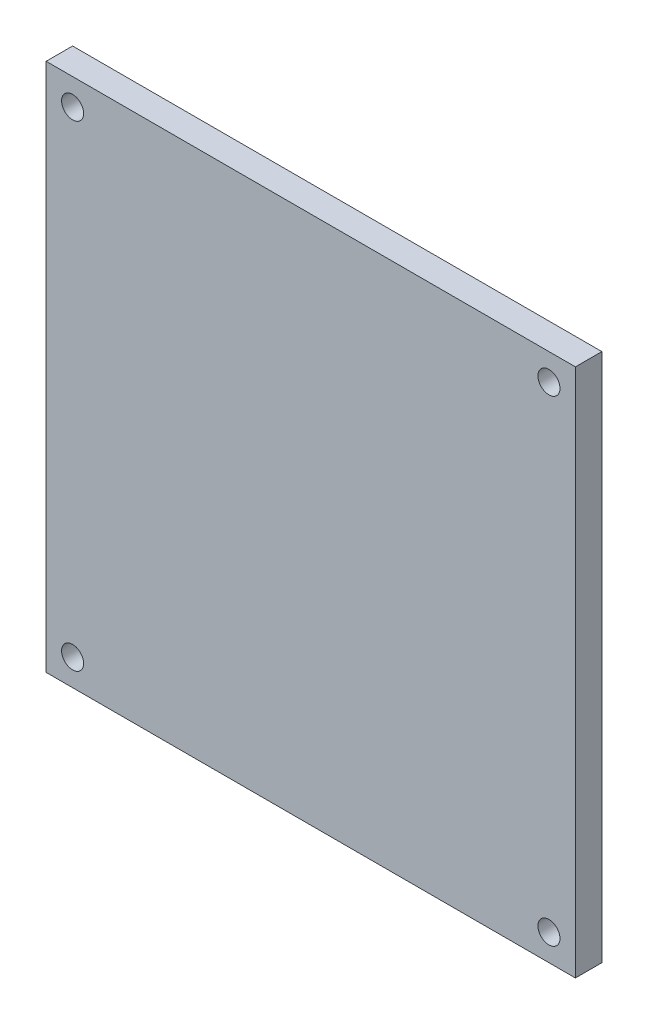
ISO-10303-21;
HEADER;
FILE_DESCRIPTION(('STEP AP214'),'2;1');
FILE_NAME('part.step','',(''),(''),'','','');
FILE_SCHEMA(('AUTOMOTIVE_DESIGN { 1 0 10303 214 1 1 1 1 }'));
ENDSEC;
DATA;
#1=APPLICATION_CONTEXT('core data for automotive mechanical design processes');
#2=APPLICATION_PROTOCOL_DEFINITION('international standard','automotive_design',2000,#1);
#3=PRODUCT_CONTEXT('',#1,'mechanical');
#4=PRODUCT('Part','Part','',(#3));
#5=PRODUCT_RELATED_PRODUCT_CATEGORY('part','',(#4));
#6=PRODUCT_DEFINITION_FORMATION('','',#4);
#7=PRODUCT_DEFINITION_CONTEXT('part definition',#1,'design');
#8=PRODUCT_DEFINITION('design','',#6,#7);
#9=PRODUCT_DEFINITION_SHAPE('','',#8);
#10=(LENGTH_UNIT() NAMED_UNIT(*) SI_UNIT(.MILLI.,.METRE.));
#11=(NAMED_UNIT(*) PLANE_ANGLE_UNIT() SI_UNIT($,.RADIAN.));
#12=(NAMED_UNIT(*) SI_UNIT($,.STERADIAN.) SOLID_ANGLE_UNIT());
#13=UNCERTAINTY_MEASURE_WITH_UNIT(LENGTH_MEASURE(1.E-05),#10,'distance_accuracy_value','');
#14=(GEOMETRIC_REPRESENTATION_CONTEXT(3) GLOBAL_UNCERTAINTY_ASSIGNED_CONTEXT((#13)) GLOBAL_UNIT_ASSIGNED_CONTEXT((#10,
#11,#12)) REPRESENTATION_CONTEXT('',''));
#15=CARTESIAN_POINT('',(0.,0.,0.));
#16=DIRECTION('',(0.,0.,1.));
#17=DIRECTION('',(1.,0.,0.));
#18=AXIS2_PLACEMENT_3D('',#15,#16,#17);
#19=CARTESIAN_POINT('',(-30.,-30.,-4.));
#20=DIRECTION('',(-1.,0.,0.));
#21=DIRECTION('',(0.,0.,1.));
#22=AXIS2_PLACEMENT_3D('',#19,#20,#21);
#23=PLANE('',#22);
#24=DIRECTION('',(0.,1.,0.));
#25=VECTOR('',#24,1.);
#26=CARTESIAN_POINT('',(-30.,-30.,-7.));
#27=LINE('',#26,#25);
#28=CARTESIAN_POINT('',(-30.,-30.,-7.));
#29=VERTEX_POINT('',#28);
#30=CARTESIAN_POINT('',(-30.,30.,-7.));
#31=VERTEX_POINT('',#30);
#32=EDGE_CURVE('E98',#29,#31,#27,.T.);
#33=ORIENTED_EDGE('',*,*,#32,.F.);
#34=DIRECTION('',(0.,0.,-1.));
#35=VECTOR('',#34,1.);
#36=CARTESIAN_POINT('',(-30.,-30.,-4.));
#37=LINE('',#36,#35);
#38=CARTESIAN_POINT('',(-30.,-30.,-4.));
#39=VERTEX_POINT('',#38);
#40=EDGE_CURVE('E11',#39,#29,#37,.T.);
#41=ORIENTED_EDGE('',*,*,#40,.F.);
#42=DIRECTION('',(0.,1.,0.));
#43=VECTOR('',#42,1.);
#44=CARTESIAN_POINT('',(-30.,-30.,-4.));
#45=LINE('',#44,#43);
#46=CARTESIAN_POINT('',(-30.,30.,-4.));
#47=VERTEX_POINT('',#46);
#48=EDGE_CURVE('E91',#39,#47,#45,.T.);
#49=ORIENTED_EDGE('',*,*,#48,.T.);
#50=DIRECTION('',(0.,0.,-1.));
#51=VECTOR('',#50,1.);
#52=CARTESIAN_POINT('',(-30.,30.,-4.));
#53=LINE('',#52,#51);
#54=EDGE_CURVE('E36',#47,#31,#53,.T.);
#55=ORIENTED_EDGE('',*,*,#54,.T.);
#56=EDGE_LOOP('',(#33,#41,#49,#55));
#57=FACE_BOUND('',#56,.T.);
#58=ADVANCED_FACE('F33',(#57),#23,.T.);
#59=CARTESIAN_POINT('',(30.,-30.,-4.));
#60=DIRECTION('',(0.,-1.,0.));
#61=DIRECTION('',(0.,0.,-1.));
#62=AXIS2_PLACEMENT_3D('',#59,#60,#61);
#63=PLANE('',#62);
#64=DIRECTION('',(-1.,0.,0.));
#65=VECTOR('',#64,1.);
#66=CARTESIAN_POINT('',(30.,-30.,-7.));
#67=LINE('',#66,#65);
#68=CARTESIAN_POINT('',(30.,-30.,-7.));
#69=VERTEX_POINT('',#68);
#70=EDGE_CURVE('E93',#69,#29,#67,.T.);
#71=ORIENTED_EDGE('',*,*,#70,.F.);
#72=DIRECTION('',(0.,0.,-1.));
#73=VECTOR('',#72,1.);
#74=CARTESIAN_POINT('',(30.,-30.,-4.));
#75=LINE('',#74,#73);
#76=CARTESIAN_POINT('',(30.,-30.,-4.));
#77=VERTEX_POINT('',#76);
#78=EDGE_CURVE('E42',#77,#69,#75,.T.);
#79=ORIENTED_EDGE('',*,*,#78,.F.);
#80=DIRECTION('',(-1.,0.,0.));
#81=VECTOR('',#80,1.);
#82=CARTESIAN_POINT('',(30.,-30.,-4.));
#83=LINE('',#82,#81);
#84=EDGE_CURVE('E88',#77,#39,#83,.T.);
#85=ORIENTED_EDGE('',*,*,#84,.T.);
#86=ORIENTED_EDGE('',*,*,#40,.T.);
#87=EDGE_LOOP('',(#71,#79,#85,#86));
#88=FACE_BOUND('',#87,.T.);
#89=ADVANCED_FACE('F109',(#88),#63,.T.);
#90=CARTESIAN_POINT('',(30.,-30.,-4.));
#91=DIRECTION('',(1.,0.,0.));
#92=DIRECTION('',(0.,0.,-1.));
#93=AXIS2_PLACEMENT_3D('',#90,#91,#92);
#94=PLANE('',#93);
#95=DIRECTION('',(0.,-1.,0.));
#96=VECTOR('',#95,1.);
#97=CARTESIAN_POINT('',(30.,-30.,-7.));
#98=LINE('',#97,#96);
#99=CARTESIAN_POINT('',(30.,30.,-7.));
#100=VERTEX_POINT('',#99);
#101=EDGE_CURVE('E83',#100,#69,#98,.T.);
#102=ORIENTED_EDGE('',*,*,#101,.F.);
#103=DIRECTION('',(0.,0.,-1.));
#104=VECTOR('',#103,1.);
#105=CARTESIAN_POINT('',(30.,30.,-4.));
#106=LINE('',#105,#104);
#107=CARTESIAN_POINT('',(30.,30.,-4.));
#108=VERTEX_POINT('',#107);
#109=EDGE_CURVE('E78',#108,#100,#106,.T.);
#110=ORIENTED_EDGE('',*,*,#109,.F.);
#111=DIRECTION('',(0.,-1.,0.));
#112=VECTOR('',#111,1.);
#113=CARTESIAN_POINT('',(30.,-30.,-4.));
#114=LINE('',#113,#112);
#115=EDGE_CURVE('E81',#108,#77,#114,.T.);
#116=ORIENTED_EDGE('',*,*,#115,.T.);
#117=ORIENTED_EDGE('',*,*,#78,.T.);
#118=EDGE_LOOP('',(#102,#110,#116,#117));
#119=FACE_BOUND('',#118,.T.);
#120=ADVANCED_FACE('F80',(#119),#94,.T.);
#121=CARTESIAN_POINT('',(30.,30.,-4.));
#122=DIRECTION('',(0.,1.,0.));
#123=DIRECTION('',(0.,0.,1.));
#124=AXIS2_PLACEMENT_3D('',#121,#122,#123);
#125=PLANE('',#124);
#126=DIRECTION('',(1.,0.,0.));
#127=VECTOR('',#126,1.);
#128=CARTESIAN_POINT('',(30.,30.,-7.));
#129=LINE('',#128,#127);
#130=EDGE_CURVE('E101',#31,#100,#129,.T.);
#131=ORIENTED_EDGE('',*,*,#130,.F.);
#132=ORIENTED_EDGE('',*,*,#54,.F.);
#133=DIRECTION('',(1.,0.,0.));
#134=VECTOR('',#133,1.);
#135=CARTESIAN_POINT('',(30.,30.,-4.));
#136=LINE('',#135,#134);
#137=EDGE_CURVE('E87',#47,#108,#136,.T.);
#138=ORIENTED_EDGE('',*,*,#137,.T.);
#139=ORIENTED_EDGE('',*,*,#109,.T.);
#140=EDGE_LOOP('',(#131,#132,#138,#139));
#141=FACE_BOUND('',#140,.T.);
#142=ADVANCED_FACE('F90',(#141),#125,.T.);
#143=CARTESIAN_POINT('',(0.,0.,-4.));
#144=DIRECTION('',(0.,0.,1.));
#145=DIRECTION('',(1.,0.,0.));
#146=AXIS2_PLACEMENT_3D('',#143,#144,#145);
#147=PLANE('',#146);
#148=CARTESIAN_POINT('',(-27.,27.,-4.));
#149=DIRECTION('',(0.,0.,1.));
#150=DIRECTION('',(1.,0.,0.));
#151=AXIS2_PLACEMENT_3D('',#148,#149,#150);
#152=CIRCLE('',#151,1.24999999999999);
#153=CARTESIAN_POINT('',(-25.75,27.,-4.));
#154=VERTEX_POINT('',#153);
#155=EDGE_CURVE('E153',#154,#154,#152,.T.);
#156=ORIENTED_EDGE('',*,*,#155,.F.);
#157=EDGE_LOOP('',(#156));
#158=FACE_BOUND('',#157,.T.);
#159=CARTESIAN_POINT('',(-27.,-27.,-4.));
#160=DIRECTION('',(0.,0.,1.));
#161=DIRECTION('',(1.,0.,0.));
#162=AXIS2_PLACEMENT_3D('',#159,#160,#161);
#163=CIRCLE('',#162,1.24999999999999);
#164=CARTESIAN_POINT('',(-25.75,-27.,-4.));
#165=VERTEX_POINT('',#164);
#166=EDGE_CURVE('E155',#165,#165,#163,.T.);
#167=ORIENTED_EDGE('',*,*,#166,.F.);
#168=EDGE_LOOP('',(#167));
#169=FACE_BOUND('',#168,.T.);
#170=CARTESIAN_POINT('',(27.,-27.,-4.));
#171=DIRECTION('',(0.,0.,1.));
#172=DIRECTION('',(1.,0.,0.));
#173=AXIS2_PLACEMENT_3D('',#170,#171,#172);
#174=CIRCLE('',#173,1.24999999999999);
#175=CARTESIAN_POINT('',(28.25,-27.,-4.));
#176=VERTEX_POINT('',#175);
#177=EDGE_CURVE('E163',#176,#176,#174,.T.);
#178=ORIENTED_EDGE('',*,*,#177,.F.);
#179=EDGE_LOOP('',(#178));
#180=FACE_BOUND('',#179,.T.);
#181=CARTESIAN_POINT('',(27.,27.,-4.));
#182=DIRECTION('',(0.,0.,1.));
#183=DIRECTION('',(1.,0.,0.));
#184=AXIS2_PLACEMENT_3D('',#181,#182,#183);
#185=CIRCLE('',#184,1.24999999999999);
#186=CARTESIAN_POINT('',(28.25,27.,-4.));
#187=VERTEX_POINT('',#186);
#188=EDGE_CURVE('E169',#187,#187,#185,.T.);
#189=ORIENTED_EDGE('',*,*,#188,.F.);
#190=EDGE_LOOP('',(#189));
#191=FACE_BOUND('',#190,.T.);
#192=ORIENTED_EDGE('',*,*,#48,.F.);
#193=ORIENTED_EDGE('',*,*,#84,.F.);
#194=ORIENTED_EDGE('',*,*,#115,.F.);
#195=ORIENTED_EDGE('',*,*,#137,.F.);
#196=EDGE_LOOP('',(#192,#193,#194,#195));
#197=FACE_BOUND('',#196,.T.);
#198=ADVANCED_FACE('F86',(#158,#169,#180,#191,#197),#147,.T.);
#199=CARTESIAN_POINT('',(0.,0.,-7.));
#200=DIRECTION('',(0.,0.,1.));
#201=DIRECTION('',(1.,0.,0.));
#202=AXIS2_PLACEMENT_3D('',#199,#200,#201);
#203=PLANE('',#202);
#204=CARTESIAN_POINT('',(-27.,27.,-7.));
#205=DIRECTION('',(0.,0.,1.));
#206=DIRECTION('',(1.,0.,0.));
#207=AXIS2_PLACEMENT_3D('',#204,#205,#206);
#208=CIRCLE('',#207,1.25);
#209=CARTESIAN_POINT('',(-25.75,27.,-7.));
#210=VERTEX_POINT('',#209);
#211=EDGE_CURVE('E151',#210,#210,#208,.T.);
#212=ORIENTED_EDGE('',*,*,#211,.T.);
#213=EDGE_LOOP('',(#212));
#214=FACE_BOUND('',#213,.T.);
#215=CARTESIAN_POINT('',(-27.,-27.,-7.));
#216=DIRECTION('',(0.,0.,1.));
#217=DIRECTION('',(1.,0.,0.));
#218=AXIS2_PLACEMENT_3D('',#215,#216,#217);
#219=CIRCLE('',#218,1.25);
#220=CARTESIAN_POINT('',(-25.75,-27.,-7.));
#221=VERTEX_POINT('',#220);
#222=EDGE_CURVE('E160',#221,#221,#219,.T.);
#223=ORIENTED_EDGE('',*,*,#222,.T.);
#224=EDGE_LOOP('',(#223));
#225=FACE_BOUND('',#224,.T.);
#226=CARTESIAN_POINT('',(27.,-27.,-7.));
#227=DIRECTION('',(0.,0.,1.));
#228=DIRECTION('',(1.,0.,0.));
#229=AXIS2_PLACEMENT_3D('',#226,#227,#228);
#230=CIRCLE('',#229,1.25);
#231=CARTESIAN_POINT('',(28.25,-27.,-7.));
#232=VERTEX_POINT('',#231);
#233=EDGE_CURVE('E166',#232,#232,#230,.T.);
#234=ORIENTED_EDGE('',*,*,#233,.T.);
#235=EDGE_LOOP('',(#234));
#236=FACE_BOUND('',#235,.T.);
#237=CARTESIAN_POINT('',(27.,27.,-7.));
#238=DIRECTION('',(0.,0.,1.));
#239=DIRECTION('',(1.,0.,0.));
#240=AXIS2_PLACEMENT_3D('',#237,#238,#239);
#241=CIRCLE('',#240,1.25);
#242=CARTESIAN_POINT('',(28.25,27.,-7.));
#243=VERTEX_POINT('',#242);
#244=EDGE_CURVE('E102',#243,#243,#241,.T.);
#245=ORIENTED_EDGE('',*,*,#244,.T.);
#246=EDGE_LOOP('',(#245));
#247=FACE_BOUND('',#246,.T.);
#248=ORIENTED_EDGE('',*,*,#32,.T.);
#249=ORIENTED_EDGE('',*,*,#130,.T.);
#250=ORIENTED_EDGE('',*,*,#101,.T.);
#251=ORIENTED_EDGE('',*,*,#70,.T.);
#252=EDGE_LOOP('',(#248,#249,#250,#251));
#253=FACE_BOUND('',#252,.T.);
#254=ADVANCED_FACE('F108',(#214,#225,#236,#247,#253),#203,.F.);
#255=CARTESIAN_POINT('',(27.,27.,-4.));
#256=DIRECTION('',(0.,0.,1.));
#257=DIRECTION('',(1.,0.,0.));
#258=AXIS2_PLACEMENT_3D('',#255,#256,#257);
#259=CYLINDRICAL_SURFACE('',#258,1.24999999999999);
#260=ORIENTED_EDGE('',*,*,#244,.F.);
#261=EDGE_LOOP('',(#260));
#262=FACE_BOUND('',#261,.T.);
#263=ORIENTED_EDGE('',*,*,#188,.T.);
#264=EDGE_LOOP('',(#263));
#265=FACE_BOUND('',#264,.T.);
#266=ADVANCED_FACE('F127',(#262,#265),#259,.F.);
#267=CARTESIAN_POINT('',(27.,-27.,-4.));
#268=DIRECTION('',(0.,0.,1.));
#269=DIRECTION('',(1.,0.,0.));
#270=AXIS2_PLACEMENT_3D('',#267,#268,#269);
#271=CYLINDRICAL_SURFACE('',#270,1.24999999999999);
#272=ORIENTED_EDGE('',*,*,#233,.F.);
#273=EDGE_LOOP('',(#272));
#274=FACE_BOUND('',#273,.T.);
#275=ORIENTED_EDGE('',*,*,#177,.T.);
#276=EDGE_LOOP('',(#275));
#277=FACE_BOUND('',#276,.T.);
#278=ADVANCED_FACE('F134',(#274,#277),#271,.F.);
#279=CARTESIAN_POINT('',(-27.,-27.,-4.));
#280=DIRECTION('',(0.,0.,1.));
#281=DIRECTION('',(1.,0.,0.));
#282=AXIS2_PLACEMENT_3D('',#279,#280,#281);
#283=CYLINDRICAL_SURFACE('',#282,1.24999999999999);
#284=ORIENTED_EDGE('',*,*,#222,.F.);
#285=EDGE_LOOP('',(#284));
#286=FACE_BOUND('',#285,.T.);
#287=ORIENTED_EDGE('',*,*,#166,.T.);
#288=EDGE_LOOP('',(#287));
#289=FACE_BOUND('',#288,.T.);
#290=ADVANCED_FACE('F138',(#286,#289),#283,.F.);
#291=CARTESIAN_POINT('',(-27.,27.,-4.));
#292=DIRECTION('',(0.,0.,1.));
#293=DIRECTION('',(1.,0.,0.));
#294=AXIS2_PLACEMENT_3D('',#291,#292,#293);
#295=CYLINDRICAL_SURFACE('',#294,1.24999999999999);
#296=ORIENTED_EDGE('',*,*,#211,.F.);
#297=EDGE_LOOP('',(#296));
#298=FACE_BOUND('',#297,.T.);
#299=ORIENTED_EDGE('',*,*,#155,.T.);
#300=EDGE_LOOP('',(#299));
#301=FACE_BOUND('',#300,.T.);
#302=ADVANCED_FACE('F142',(#298,#301),#295,.F.);
#303=CLOSED_SHELL('',(#58,#89,#120,#142,#198,#254,#266,#278,#290,#302));
#304=MANIFOLD_SOLID_BREP('B2',#303);
#305=ADVANCED_BREP_SHAPE_REPRESENTATION('',(#18,#304),#14);
#306=SHAPE_DEFINITION_REPRESENTATION(#9,#305);
ENDSEC;
END-ISO-10303-21;
